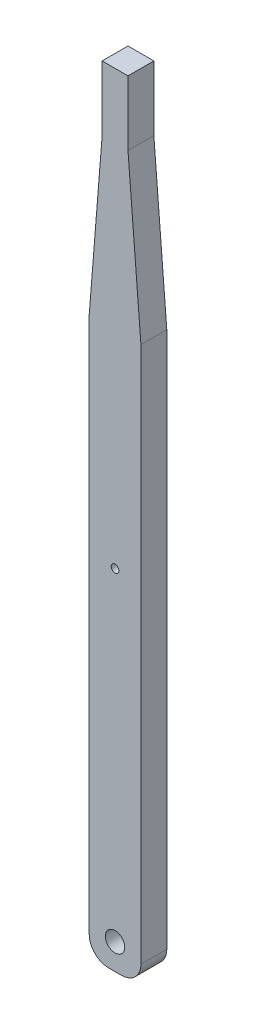
ISO-10303-21;
HEADER;
FILE_DESCRIPTION(('STEP AP214'),'2;1');
FILE_NAME('part.step','',(''),(''),'','','');
FILE_SCHEMA(('AUTOMOTIVE_DESIGN { 1 0 10303 214 1 1 1 1 }'));
ENDSEC;
DATA;
#1=APPLICATION_CONTEXT('core data for automotive mechanical design processes');
#2=APPLICATION_PROTOCOL_DEFINITION('international standard','automotive_design',2000,#1);
#3=PRODUCT_CONTEXT('',#1,'mechanical');
#4=PRODUCT('Part','Part','',(#3));
#5=PRODUCT_RELATED_PRODUCT_CATEGORY('part','',(#4));
#6=PRODUCT_DEFINITION_FORMATION('','',#4);
#7=PRODUCT_DEFINITION_CONTEXT('part definition',#1,'design');
#8=PRODUCT_DEFINITION('design','',#6,#7);
#9=PRODUCT_DEFINITION_SHAPE('','',#8);
#10=(LENGTH_UNIT() NAMED_UNIT(*) SI_UNIT(.MILLI.,.METRE.));
#11=(NAMED_UNIT(*) PLANE_ANGLE_UNIT() SI_UNIT($,.RADIAN.));
#12=(NAMED_UNIT(*) SI_UNIT($,.STERADIAN.) SOLID_ANGLE_UNIT());
#13=UNCERTAINTY_MEASURE_WITH_UNIT(LENGTH_MEASURE(1.E-05),#10,'distance_accuracy_value','');
#14=(GEOMETRIC_REPRESENTATION_CONTEXT(3) GLOBAL_UNCERTAINTY_ASSIGNED_CONTEXT((#13)) GLOBAL_UNIT_ASSIGNED_CONTEXT((#10,
#11,#12)) REPRESENTATION_CONTEXT('',''));
#15=CARTESIAN_POINT('',(0.,0.,0.));
#16=DIRECTION('',(0.,0.,1.));
#17=DIRECTION('',(1.,0.,0.));
#18=AXIS2_PLACEMENT_3D('',#15,#16,#17);
#19=CARTESIAN_POINT('',(-4.,-60.5,4.));
#20=DIRECTION('',(1.,0.,0.));
#21=DIRECTION('',(0.,0.,-1.));
#22=AXIS2_PLACEMENT_3D('',#19,#20,#21);
#23=PLANE('',#22);
#24=DIRECTION('',(0.,-1.,0.));
#25=VECTOR('',#24,1.);
#26=CARTESIAN_POINT('',(-4.,-60.5,4.));
#27=LINE('',#26,#25);
#28=CARTESIAN_POINT('',(-4.,25.5,4.));
#29=VERTEX_POINT('',#28);
#30=CARTESIAN_POINT('',(-4.,-57.5,4.));
#31=VERTEX_POINT('',#30);
#32=EDGE_CURVE('E123',#29,#31,#27,.T.);
#33=ORIENTED_EDGE('',*,*,#32,.F.);
#34=DIRECTION('',(0.,0.,1.));
#35=VECTOR('',#34,1.);
#36=CARTESIAN_POINT('',(-4.,25.5,-35.0570962859162));
#37=LINE('',#36,#35);
#38=CARTESIAN_POINT('',(-4.,25.5,0.));
#39=VERTEX_POINT('',#38);
#40=EDGE_CURVE('E109',#39,#29,#37,.T.);
#41=ORIENTED_EDGE('',*,*,#40,.F.);
#42=DIRECTION('',(0.,-1.,0.));
#43=VECTOR('',#42,1.);
#44=CARTESIAN_POINT('',(-4.,-60.5,0.));
#45=LINE('',#44,#43);
#46=CARTESIAN_POINT('',(-4.,-57.5,0.));
#47=VERTEX_POINT('',#46);
#48=EDGE_CURVE('E146',#39,#47,#45,.T.);
#49=ORIENTED_EDGE('',*,*,#48,.T.);
#50=DIRECTION('',(0.,0.,-1.));
#51=VECTOR('',#50,1.);
#52=CARTESIAN_POINT('',(-4.,-57.5,4.));
#53=LINE('',#52,#51);
#54=EDGE_CURVE('E11',#47,#31,#53,.F.);
#55=ORIENTED_EDGE('',*,*,#54,.T.);
#56=EDGE_LOOP('',(#33,#41,#49,#55));
#57=FACE_BOUND('',#56,.T.);
#58=ADVANCED_FACE('F33',(#57),#23,.F.);
#59=CARTESIAN_POINT('',(4.,-60.5,4.));
#60=DIRECTION('',(0.,1.,0.));
#61=DIRECTION('',(0.,0.,1.));
#62=AXIS2_PLACEMENT_3D('',#59,#60,#61);
#63=PLANE('',#62);
#64=DIRECTION('',(1.,0.,0.));
#65=VECTOR('',#64,1.);
#66=CARTESIAN_POINT('',(4.,-60.5,0.));
#67=LINE('',#66,#65);
#68=CARTESIAN_POINT('',(-1.,-60.5,0.));
#69=VERTEX_POINT('',#68);
#70=CARTESIAN_POINT('',(1.,-60.5,0.));
#71=VERTEX_POINT('',#70);
#72=EDGE_CURVE('E148',#69,#71,#67,.T.);
#73=ORIENTED_EDGE('',*,*,#72,.T.);
#74=DIRECTION('',(0.,0.,-1.));
#75=VECTOR('',#74,1.);
#76=CARTESIAN_POINT('',(1.,-60.5,4.));
#77=LINE('',#76,#75);
#78=CARTESIAN_POINT('',(1.,-60.5,4.));
#79=VERTEX_POINT('',#78);
#80=EDGE_CURVE('E163',#71,#79,#77,.F.);
#81=ORIENTED_EDGE('',*,*,#80,.T.);
#82=DIRECTION('',(1.,0.,0.));
#83=VECTOR('',#82,1.);
#84=CARTESIAN_POINT('',(4.,-60.5,4.));
#85=LINE('',#84,#83);
#86=CARTESIAN_POINT('',(-1.,-60.5,4.));
#87=VERTEX_POINT('',#86);
#88=EDGE_CURVE('E129',#87,#79,#85,.T.);
#89=ORIENTED_EDGE('',*,*,#88,.F.);
#90=DIRECTION('',(0.,0.,-1.));
#91=VECTOR('',#90,1.);
#92=CARTESIAN_POINT('',(-1.,-60.5,4.));
#93=LINE('',#92,#91);
#94=EDGE_CURVE('E160',#87,#69,#93,.T.);
#95=ORIENTED_EDGE('',*,*,#94,.T.);
#96=EDGE_LOOP('',(#73,#81,#89,#95));
#97=FACE_BOUND('',#96,.T.);
#98=ADVANCED_FACE('F185',(#97),#63,.F.);
#99=CARTESIAN_POINT('',(4.,-60.5,4.));
#100=DIRECTION('',(-1.,0.,0.));
#101=DIRECTION('',(0.,0.,1.));
#102=AXIS2_PLACEMENT_3D('',#99,#100,#101);
#103=PLANE('',#102);
#104=DIRECTION('',(0.,1.,0.));
#105=VECTOR('',#104,1.);
#106=CARTESIAN_POINT('',(4.,-60.5,0.));
#107=LINE('',#106,#105);
#108=CARTESIAN_POINT('',(4.,-57.5,0.));
#109=VERTEX_POINT('',#108);
#110=CARTESIAN_POINT('',(4.,25.5,0.));
#111=VERTEX_POINT('',#110);
#112=EDGE_CURVE('E136',#109,#111,#107,.T.);
#113=ORIENTED_EDGE('',*,*,#112,.T.);
#114=DIRECTION('',(0.,0.,1.));
#115=VECTOR('',#114,1.);
#116=CARTESIAN_POINT('',(4.,25.5,-35.0570962859162));
#117=LINE('',#116,#115);
#118=CARTESIAN_POINT('',(4.,25.5,4.));
#119=VERTEX_POINT('',#118);
#120=EDGE_CURVE('E178',#111,#119,#117,.T.);
#121=ORIENTED_EDGE('',*,*,#120,.T.);
#122=DIRECTION('',(0.,1.,0.));
#123=VECTOR('',#122,1.);
#124=CARTESIAN_POINT('',(4.,-60.5,4.));
#125=LINE('',#124,#123);
#126=CARTESIAN_POINT('',(4.,-57.5,4.));
#127=VERTEX_POINT('',#126);
#128=EDGE_CURVE('E133',#127,#119,#125,.T.);
#129=ORIENTED_EDGE('',*,*,#128,.F.);
#130=DIRECTION('',(0.,0.,-1.));
#131=VECTOR('',#130,1.);
#132=CARTESIAN_POINT('',(4.,-57.5,4.));
#133=LINE('',#132,#131);
#134=EDGE_CURVE('E145',#127,#109,#133,.T.);
#135=ORIENTED_EDGE('',*,*,#134,.T.);
#136=EDGE_LOOP('',(#113,#121,#129,#135));
#137=FACE_BOUND('',#136,.T.);
#138=ADVANCED_FACE('F176',(#137),#103,.F.);
#139=CARTESIAN_POINT('',(4.,60.5,4.));
#140=DIRECTION('',(0.,-1.,0.));
#141=DIRECTION('',(0.,0.,-1.));
#142=AXIS2_PLACEMENT_3D('',#139,#140,#141);
#143=PLANE('',#142);
#144=DIRECTION('',(-1.,0.,0.));
#145=VECTOR('',#144,1.);
#146=CARTESIAN_POINT('',(4.,60.5,0.));
#147=LINE('',#146,#145);
#148=CARTESIAN_POINT('',(2.,60.5,0.));
#149=VERTEX_POINT('',#148);
#150=CARTESIAN_POINT('',(-2.,60.5,0.));
#151=VERTEX_POINT('',#150);
#152=EDGE_CURVE('E130',#149,#151,#147,.T.);
#153=ORIENTED_EDGE('',*,*,#152,.T.);
#154=DIRECTION('',(0.,0.,1.));
#155=VECTOR('',#154,1.);
#156=CARTESIAN_POINT('',(-2.,60.5,-35.0570962859162));
#157=LINE('',#156,#155);
#158=CARTESIAN_POINT('',(-2.,60.5,4.));
#159=VERTEX_POINT('',#158);
#160=EDGE_CURVE('E192',#151,#159,#157,.T.);
#161=ORIENTED_EDGE('',*,*,#160,.T.);
#162=DIRECTION('',(-1.,0.,0.));
#163=VECTOR('',#162,1.);
#164=CARTESIAN_POINT('',(4.,60.5,4.));
#165=LINE('',#164,#163);
#166=CARTESIAN_POINT('',(2.,60.5,4.));
#167=VERTEX_POINT('',#166);
#168=EDGE_CURVE('E143',#167,#159,#165,.T.);
#169=ORIENTED_EDGE('',*,*,#168,.F.);
#170=DIRECTION('',(0.,0.,1.));
#171=VECTOR('',#170,1.);
#172=CARTESIAN_POINT('',(2.,60.5,-35.0570962859162));
#173=LINE('',#172,#171);
#174=EDGE_CURVE('E203',#149,#167,#173,.T.);
#175=ORIENTED_EDGE('',*,*,#174,.F.);
#176=EDGE_LOOP('',(#153,#161,#169,#175));
#177=FACE_BOUND('',#176,.T.);
#178=ADVANCED_FACE('F212',(#177),#143,.F.);
#179=CARTESIAN_POINT('',(0.,0.,4.));
#180=DIRECTION('',(0.,0.,1.));
#181=DIRECTION('',(1.,0.,0.));
#182=AXIS2_PLACEMENT_3D('',#179,#180,#181);
#183=PLANE('',#182);
#184=CARTESIAN_POINT('',(0.,-6.50000000000001,4.));
#185=DIRECTION('',(0.,0.,1.));
#186=DIRECTION('',(1.,0.,0.));
#187=AXIS2_PLACEMENT_3D('',#184,#185,#186);
#188=CIRCLE('',#187,0.6);
#189=CARTESIAN_POINT('',(0.6,-6.50000000000001,4.));
#190=VERTEX_POINT('',#189);
#191=EDGE_CURVE('E222',#190,#190,#188,.T.);
#192=ORIENTED_EDGE('',*,*,#191,.F.);
#193=EDGE_LOOP('',(#192));
#194=FACE_BOUND('',#193,.T.);
#195=CARTESIAN_POINT('',(0.,-56.5,4.));
#196=DIRECTION('',(0.,0.,1.));
#197=DIRECTION('',(1.,0.,0.));
#198=AXIS2_PLACEMENT_3D('',#195,#196,#197);
#199=CIRCLE('',#198,1.49999999999999);
#200=CARTESIAN_POINT('',(1.49999999999999,-56.5,4.));
#201=VERTEX_POINT('',#200);
#202=EDGE_CURVE('E219',#201,#201,#199,.T.);
#203=ORIENTED_EDGE('',*,*,#202,.F.);
#204=EDGE_LOOP('',(#203));
#205=FACE_BOUND('',#204,.T.);
#206=DIRECTION('',(0.,1.,0.));
#207=VECTOR('',#206,1.);
#208=CARTESIAN_POINT('',(-2.,50.5,4.));
#209=LINE('',#208,#207);
#210=CARTESIAN_POINT('',(-2.,50.5,4.));
#211=VERTEX_POINT('',#210);
#212=EDGE_CURVE('E119',#211,#159,#209,.T.);
#213=ORIENTED_EDGE('',*,*,#212,.F.);
#214=DIRECTION('',(0.07974522228289,0.996815278536125,0.));
#215=VECTOR('',#214,1.);
#216=CARTESIAN_POINT('',(-4.,25.5,4.));
#217=LINE('',#216,#215);
#218=EDGE_CURVE('E112',#29,#211,#217,.T.);
#219=ORIENTED_EDGE('',*,*,#218,.F.);
#220=ORIENTED_EDGE('',*,*,#32,.T.);
#221=CARTESIAN_POINT('',(-1.,-57.5,4.));
#222=DIRECTION('',(0.,0.,1.));
#223=DIRECTION('',(1.,0.,0.));
#224=AXIS2_PLACEMENT_3D('',#221,#222,#223);
#225=CIRCLE('',#224,3.);
#226=EDGE_CURVE('E165',#31,#87,#225,.T.);
#227=ORIENTED_EDGE('',*,*,#226,.T.);
#228=ORIENTED_EDGE('',*,*,#88,.T.);
#229=CARTESIAN_POINT('',(1.,-57.5,4.));
#230=DIRECTION('',(0.,0.,1.));
#231=DIRECTION('',(1.,0.,0.));
#232=AXIS2_PLACEMENT_3D('',#229,#230,#231);
#233=CIRCLE('',#232,3.);
#234=EDGE_CURVE('E42',#79,#127,#233,.T.);
#235=ORIENTED_EDGE('',*,*,#234,.T.);
#236=ORIENTED_EDGE('',*,*,#128,.T.);
#237=DIRECTION('',(0.07974522228289,-0.996815278536125,0.));
#238=VECTOR('',#237,1.);
#239=CARTESIAN_POINT('',(2.,50.5,4.));
#240=LINE('',#239,#238);
#241=CARTESIAN_POINT('',(2.,50.5,4.));
#242=VERTEX_POINT('',#241);
#243=EDGE_CURVE('E200',#242,#119,#240,.T.);
#244=ORIENTED_EDGE('',*,*,#243,.F.);
#245=DIRECTION('',(0.,-1.,0.));
#246=VECTOR('',#245,1.);
#247=CARTESIAN_POINT('',(2.,60.5,4.));
#248=LINE('',#247,#246);
#249=EDGE_CURVE('E198',#167,#242,#248,.T.);
#250=ORIENTED_EDGE('',*,*,#249,.F.);
#251=ORIENTED_EDGE('',*,*,#168,.T.);
#252=EDGE_LOOP('',(#213,#219,#220,#227,#228,#235,#236,#244,#250,#251));
#253=FACE_BOUND('',#252,.T.);
#254=ADVANCED_FACE('F122',(#194,#205,#253),#183,.T.);
#255=CARTESIAN_POINT('',(0.,0.,0.));
#256=DIRECTION('',(0.,0.,1.));
#257=DIRECTION('',(1.,0.,0.));
#258=AXIS2_PLACEMENT_3D('',#255,#256,#257);
#259=PLANE('',#258);
#260=CARTESIAN_POINT('',(0.,-6.50000000000001,0.));
#261=DIRECTION('',(0.,0.,1.));
#262=DIRECTION('',(1.,0.,0.));
#263=AXIS2_PLACEMENT_3D('',#260,#261,#262);
#264=CIRCLE('',#263,0.6);
#265=CARTESIAN_POINT('',(0.6,-6.50000000000001,0.));
#266=VERTEX_POINT('',#265);
#267=EDGE_CURVE('E37',#266,#266,#264,.T.);
#268=ORIENTED_EDGE('',*,*,#267,.T.);
#269=EDGE_LOOP('',(#268));
#270=FACE_BOUND('',#269,.T.);
#271=CARTESIAN_POINT('',(0.,-56.5,0.));
#272=DIRECTION('',(0.,0.,1.));
#273=DIRECTION('',(1.,0.,0.));
#274=AXIS2_PLACEMENT_3D('',#271,#272,#273);
#275=CIRCLE('',#274,1.5);
#276=CARTESIAN_POINT('',(1.5,-56.5,0.));
#277=VERTEX_POINT('',#276);
#278=EDGE_CURVE('E201',#277,#277,#275,.T.);
#279=ORIENTED_EDGE('',*,*,#278,.T.);
#280=EDGE_LOOP('',(#279));
#281=FACE_BOUND('',#280,.T.);
#282=DIRECTION('',(-0.07974522228289,-0.996815278536125,0.));
#283=VECTOR('',#282,1.);
#284=CARTESIAN_POINT('',(-4.,25.5,0.));
#285=LINE('',#284,#283);
#286=CARTESIAN_POINT('',(-2.,50.5,0.));
#287=VERTEX_POINT('',#286);
#288=EDGE_CURVE('E115',#287,#39,#285,.T.);
#289=ORIENTED_EDGE('',*,*,#288,.F.);
#290=DIRECTION('',(0.,-1.,0.));
#291=VECTOR('',#290,1.);
#292=CARTESIAN_POINT('',(-2.,50.5,0.));
#293=LINE('',#292,#291);
#294=EDGE_CURVE('E190',#151,#287,#293,.T.);
#295=ORIENTED_EDGE('',*,*,#294,.F.);
#296=ORIENTED_EDGE('',*,*,#152,.F.);
#297=DIRECTION('',(0.,1.,0.));
#298=VECTOR('',#297,1.);
#299=CARTESIAN_POINT('',(2.,60.5,0.));
#300=LINE('',#299,#298);
#301=CARTESIAN_POINT('',(2.,50.5,0.));
#302=VERTEX_POINT('',#301);
#303=EDGE_CURVE('E125',#302,#149,#300,.T.);
#304=ORIENTED_EDGE('',*,*,#303,.F.);
#305=DIRECTION('',(-0.07974522228289,0.996815278536125,0.));
#306=VECTOR('',#305,1.);
#307=CARTESIAN_POINT('',(2.,50.5,0.));
#308=LINE('',#307,#306);
#309=EDGE_CURVE('E196',#111,#302,#308,.T.);
#310=ORIENTED_EDGE('',*,*,#309,.F.);
#311=ORIENTED_EDGE('',*,*,#112,.F.);
#312=CARTESIAN_POINT('',(1.,-57.5,0.));
#313=DIRECTION('',(0.,0.,1.));
#314=DIRECTION('',(1.,0.,0.));
#315=AXIS2_PLACEMENT_3D('',#312,#313,#314);
#316=CIRCLE('',#315,3.);
#317=EDGE_CURVE('E158',#109,#71,#316,.F.);
#318=ORIENTED_EDGE('',*,*,#317,.T.);
#319=ORIENTED_EDGE('',*,*,#72,.F.);
#320=CARTESIAN_POINT('',(-1.,-57.5,0.));
#321=DIRECTION('',(0.,0.,1.));
#322=DIRECTION('',(1.,0.,0.));
#323=AXIS2_PLACEMENT_3D('',#320,#321,#322);
#324=CIRCLE('',#323,3.);
#325=EDGE_CURVE('E155',#69,#47,#324,.F.);
#326=ORIENTED_EDGE('',*,*,#325,.T.);
#327=ORIENTED_EDGE('',*,*,#48,.F.);
#328=EDGE_LOOP('',(#289,#295,#296,#304,#310,#311,#318,#319,#326,#327));
#329=FACE_BOUND('',#328,.T.);
#330=ADVANCED_FACE('F182',(#270,#281,#329),#259,.F.);
#331=CARTESIAN_POINT('',(1.,-57.5,4.));
#332=DIRECTION('',(0.,0.,-1.));
#333=DIRECTION('',(-1.,0.,0.));
#334=AXIS2_PLACEMENT_3D('',#331,#332,#333);
#335=CYLINDRICAL_SURFACE('',#334,3.);
#336=ORIENTED_EDGE('',*,*,#234,.F.);
#337=ORIENTED_EDGE('',*,*,#80,.F.);
#338=ORIENTED_EDGE('',*,*,#317,.F.);
#339=ORIENTED_EDGE('',*,*,#134,.F.);
#340=EDGE_LOOP('',(#336,#337,#338,#339));
#341=FACE_BOUND('',#340,.T.);
#342=ADVANCED_FACE('F179',(#341),#335,.T.);
#343=CARTESIAN_POINT('',(-1.,-57.5,4.));
#344=DIRECTION('',(0.,0.,-1.));
#345=DIRECTION('',(-1.,0.,0.));
#346=AXIS2_PLACEMENT_3D('',#343,#344,#345);
#347=CYLINDRICAL_SURFACE('',#346,3.);
#348=ORIENTED_EDGE('',*,*,#226,.F.);
#349=ORIENTED_EDGE('',*,*,#54,.F.);
#350=ORIENTED_EDGE('',*,*,#325,.F.);
#351=ORIENTED_EDGE('',*,*,#94,.F.);
#352=EDGE_LOOP('',(#348,#349,#350,#351));
#353=FACE_BOUND('',#352,.T.);
#354=ADVANCED_FACE('F35',(#353),#347,.T.);
#355=CARTESIAN_POINT('',(2.,50.5,-35.0570962859162));
#356=DIRECTION('',(-0.996815278536125,-0.07974522228289,0.));
#357=DIRECTION('',(0.07974522228289,-0.996815278536125,0.));
#358=AXIS2_PLACEMENT_3D('',#355,#356,#357);
#359=PLANE('',#358);
#360=ORIENTED_EDGE('',*,*,#309,.T.);
#361=DIRECTION('',(0.,0.,1.));
#362=VECTOR('',#361,1.);
#363=CARTESIAN_POINT('',(2.,50.5,-35.0570962859162));
#364=LINE('',#363,#362);
#365=EDGE_CURVE('E57',#302,#242,#364,.T.);
#366=ORIENTED_EDGE('',*,*,#365,.T.);
#367=ORIENTED_EDGE('',*,*,#243,.T.);
#368=ORIENTED_EDGE('',*,*,#120,.F.);
#369=EDGE_LOOP('',(#360,#366,#367,#368));
#370=FACE_BOUND('',#369,.T.);
#371=ADVANCED_FACE('F252',(#370),#359,.F.);
#372=CARTESIAN_POINT('',(2.,60.5,-35.0570962859162));
#373=DIRECTION('',(-1.,0.,0.));
#374=DIRECTION('',(0.,0.,1.));
#375=AXIS2_PLACEMENT_3D('',#372,#373,#374);
#376=PLANE('',#375);
#377=ORIENTED_EDGE('',*,*,#303,.T.);
#378=ORIENTED_EDGE('',*,*,#174,.T.);
#379=ORIENTED_EDGE('',*,*,#249,.T.);
#380=ORIENTED_EDGE('',*,*,#365,.F.);
#381=EDGE_LOOP('',(#377,#378,#379,#380));
#382=FACE_BOUND('',#381,.T.);
#383=ADVANCED_FACE('F207',(#382),#376,.F.);
#384=CARTESIAN_POINT('',(-2.,50.5,-35.0570962859162));
#385=DIRECTION('',(1.,0.,0.));
#386=DIRECTION('',(0.,0.,-1.));
#387=AXIS2_PLACEMENT_3D('',#384,#385,#386);
#388=PLANE('',#387);
#389=ORIENTED_EDGE('',*,*,#294,.T.);
#390=DIRECTION('',(0.,0.,1.));
#391=VECTOR('',#390,1.);
#392=CARTESIAN_POINT('',(-2.,50.5,-35.0570962859162));
#393=LINE('',#392,#391);
#394=EDGE_CURVE('E49',#287,#211,#393,.T.);
#395=ORIENTED_EDGE('',*,*,#394,.T.);
#396=ORIENTED_EDGE('',*,*,#212,.T.);
#397=ORIENTED_EDGE('',*,*,#160,.F.);
#398=EDGE_LOOP('',(#389,#395,#396,#397));
#399=FACE_BOUND('',#398,.T.);
#400=ADVANCED_FACE('F300',(#399),#388,.F.);
#401=CARTESIAN_POINT('',(-4.,25.5,-35.0570962859162));
#402=DIRECTION('',(0.996815278536125,-0.07974522228289,0.));
#403=DIRECTION('',(0.07974522228289,0.996815278536125,0.));
#404=AXIS2_PLACEMENT_3D('',#401,#402,#403);
#405=PLANE('',#404);
#406=ORIENTED_EDGE('',*,*,#288,.T.);
#407=ORIENTED_EDGE('',*,*,#40,.T.);
#408=ORIENTED_EDGE('',*,*,#218,.T.);
#409=ORIENTED_EDGE('',*,*,#394,.F.);
#410=EDGE_LOOP('',(#406,#407,#408,#409));
#411=FACE_BOUND('',#410,.T.);
#412=ADVANCED_FACE('F111',(#411),#405,.F.);
#413=CARTESIAN_POINT('',(0.,-56.5,4.));
#414=DIRECTION('',(0.,0.,1.));
#415=DIRECTION('',(1.,0.,0.));
#416=AXIS2_PLACEMENT_3D('',#413,#414,#415);
#417=CYLINDRICAL_SURFACE('',#416,1.49999999999999);
#418=ORIENTED_EDGE('',*,*,#278,.F.);
#419=EDGE_LOOP('',(#418));
#420=FACE_BOUND('',#419,.T.);
#421=ORIENTED_EDGE('',*,*,#202,.T.);
#422=EDGE_LOOP('',(#421));
#423=FACE_BOUND('',#422,.T.);
#424=ADVANCED_FACE('F233',(#420,#423),#417,.F.);
#425=CARTESIAN_POINT('',(0.,-6.50000000000001,-6.));
#426=DIRECTION('',(0.,0.,1.));
#427=DIRECTION('',(1.,0.,0.));
#428=AXIS2_PLACEMENT_3D('',#425,#426,#427);
#429=CYLINDRICAL_SURFACE('',#428,0.6);
#430=ORIENTED_EDGE('',*,*,#191,.T.);
#431=EDGE_LOOP('',(#430));
#432=FACE_BOUND('',#431,.T.);
#433=ORIENTED_EDGE('',*,*,#267,.F.);
#434=EDGE_LOOP('',(#433));
#435=FACE_BOUND('',#434,.T.);
#436=ADVANCED_FACE('F231',(#432,#435),#429,.F.);
#437=CLOSED_SHELL('',(#58,#98,#138,#178,#254,#330,#342,#354,#371,#383,#400,#412,#424,#436));
#438=MANIFOLD_SOLID_BREP('B2',#437);
#439=ADVANCED_BREP_SHAPE_REPRESENTATION('',(#18,#438),#14);
#440=SHAPE_DEFINITION_REPRESENTATION(#9,#439);
ENDSEC;
END-ISO-10303-21;
